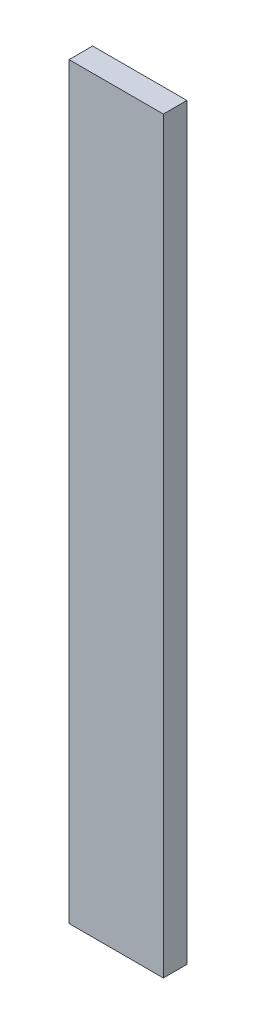
ISO-10303-21;
HEADER;
FILE_DESCRIPTION(('STEP AP214'),'2;1');
FILE_NAME('part.step','',(''),(''),'','','');
FILE_SCHEMA(('AUTOMOTIVE_DESIGN { 1 0 10303 214 1 1 1 1 }'));
ENDSEC;
DATA;
#1=APPLICATION_CONTEXT('core data for automotive mechanical design processes');
#2=APPLICATION_PROTOCOL_DEFINITION('international standard','automotive_design',2000,#1);
#3=PRODUCT_CONTEXT('',#1,'mechanical');
#4=PRODUCT('Part','Part','',(#3));
#5=PRODUCT_RELATED_PRODUCT_CATEGORY('part','',(#4));
#6=PRODUCT_DEFINITION_FORMATION('','',#4);
#7=PRODUCT_DEFINITION_CONTEXT('part definition',#1,'design');
#8=PRODUCT_DEFINITION('design','',#6,#7);
#9=PRODUCT_DEFINITION_SHAPE('','',#8);
#10=(LENGTH_UNIT() NAMED_UNIT(*) SI_UNIT(.MILLI.,.METRE.));
#11=(NAMED_UNIT(*) PLANE_ANGLE_UNIT() SI_UNIT($,.RADIAN.));
#12=(NAMED_UNIT(*) SI_UNIT($,.STERADIAN.) SOLID_ANGLE_UNIT());
#13=UNCERTAINTY_MEASURE_WITH_UNIT(LENGTH_MEASURE(1.E-05),#10,'distance_accuracy_value','');
#14=(GEOMETRIC_REPRESENTATION_CONTEXT(3) GLOBAL_UNCERTAINTY_ASSIGNED_CONTEXT((#13)) GLOBAL_UNIT_ASSIGNED_CONTEXT((#10,
#11,#12)) REPRESENTATION_CONTEXT('',''));
#15=CARTESIAN_POINT('',(0.,0.,0.));
#16=DIRECTION('',(0.,0.,1.));
#17=DIRECTION('',(1.,0.,0.));
#18=AXIS2_PLACEMENT_3D('',#15,#16,#17);
#19=CARTESIAN_POINT('',(0.,0.,0.2));
#20=DIRECTION('',(1.,0.,0.));
#21=DIRECTION('',(0.,0.,-1.));
#22=AXIS2_PLACEMENT_3D('',#19,#20,#21);
#23=PLANE('',#22);
#24=DIRECTION('',(0.,-1.,0.));
#25=VECTOR('',#24,1.);
#26=CARTESIAN_POINT('',(0.,0.,0.));
#27=LINE('',#26,#25);
#28=CARTESIAN_POINT('',(0.,6.35,0.));
#29=VERTEX_POINT('',#28);
#30=CARTESIAN_POINT('',(0.,0.,0.));
#31=VERTEX_POINT('',#30);
#32=EDGE_CURVE('E96',#29,#31,#27,.T.);
#33=ORIENTED_EDGE('',*,*,#32,.T.);
#34=DIRECTION('',(0.,0.,-1.));
#35=VECTOR('',#34,1.);
#36=CARTESIAN_POINT('',(0.,0.,0.2));
#37=LINE('',#36,#35);
#38=CARTESIAN_POINT('',(0.,0.,0.2));
#39=VERTEX_POINT('',#38);
#40=EDGE_CURVE('E11',#39,#31,#37,.T.);
#41=ORIENTED_EDGE('',*,*,#40,.F.);
#42=DIRECTION('',(0.,-1.,0.));
#43=VECTOR('',#42,1.);
#44=CARTESIAN_POINT('',(0.,0.,0.2));
#45=LINE('',#44,#43);
#46=CARTESIAN_POINT('',(0.,6.35,0.2));
#47=VERTEX_POINT('',#46);
#48=EDGE_CURVE('E84',#47,#39,#45,.T.);
#49=ORIENTED_EDGE('',*,*,#48,.F.);
#50=DIRECTION('',(0.,0.,-1.));
#51=VECTOR('',#50,1.);
#52=CARTESIAN_POINT('',(0.,6.35,0.2));
#53=LINE('',#52,#51);
#54=EDGE_CURVE('E92',#47,#29,#53,.T.);
#55=ORIENTED_EDGE('',*,*,#54,.T.);
#56=EDGE_LOOP('',(#33,#41,#49,#55));
#57=FACE_BOUND('',#56,.T.);
#58=ADVANCED_FACE('F33',(#57),#23,.F.);
#59=CARTESIAN_POINT('',(0.,0.,0.2));
#60=DIRECTION('',(0.,1.,0.));
#61=DIRECTION('',(0.,0.,1.));
#62=AXIS2_PLACEMENT_3D('',#59,#60,#61);
#63=PLANE('',#62);
#64=DIRECTION('',(1.,0.,0.));
#65=VECTOR('',#64,1.);
#66=CARTESIAN_POINT('',(0.,0.,0.));
#67=LINE('',#66,#65);
#68=CARTESIAN_POINT('',(0.8001,0.,0.));
#69=VERTEX_POINT('',#68);
#70=EDGE_CURVE('E88',#31,#69,#67,.T.);
#71=ORIENTED_EDGE('',*,*,#70,.T.);
#72=DIRECTION('',(0.,0.,-1.));
#73=VECTOR('',#72,1.);
#74=CARTESIAN_POINT('',(0.8001,0.,0.2));
#75=LINE('',#74,#73);
#76=CARTESIAN_POINT('',(0.8001,0.,0.2));
#77=VERTEX_POINT('',#76);
#78=EDGE_CURVE('E41',#77,#69,#75,.T.);
#79=ORIENTED_EDGE('',*,*,#78,.F.);
#80=DIRECTION('',(1.,0.,0.));
#81=VECTOR('',#80,1.);
#82=CARTESIAN_POINT('',(0.,0.,0.2));
#83=LINE('',#82,#81);
#84=EDGE_CURVE('E79',#39,#77,#83,.T.);
#85=ORIENTED_EDGE('',*,*,#84,.F.);
#86=ORIENTED_EDGE('',*,*,#40,.T.);
#87=EDGE_LOOP('',(#71,#79,#85,#86));
#88=FACE_BOUND('',#87,.T.);
#89=ADVANCED_FACE('F87',(#88),#63,.F.);
#90=CARTESIAN_POINT('',(0.8001,0.,0.2));
#91=DIRECTION('',(-1.,0.,0.));
#92=DIRECTION('',(0.,0.,1.));
#93=AXIS2_PLACEMENT_3D('',#90,#91,#92);
#94=PLANE('',#93);
#95=DIRECTION('',(0.,1.,0.));
#96=VECTOR('',#95,1.);
#97=CARTESIAN_POINT('',(0.8001,0.,0.));
#98=LINE('',#97,#96);
#99=CARTESIAN_POINT('',(0.8001,6.35,0.));
#100=VERTEX_POINT('',#99);
#101=EDGE_CURVE('E66',#69,#100,#98,.T.);
#102=ORIENTED_EDGE('',*,*,#101,.T.);
#103=DIRECTION('',(0.,0.,-1.));
#104=VECTOR('',#103,1.);
#105=CARTESIAN_POINT('',(0.8001,6.35,0.2));
#106=LINE('',#105,#104);
#107=CARTESIAN_POINT('',(0.8001,6.35,0.2));
#108=VERTEX_POINT('',#107);
#109=EDGE_CURVE('E89',#108,#100,#106,.T.);
#110=ORIENTED_EDGE('',*,*,#109,.F.);
#111=DIRECTION('',(0.,1.,0.));
#112=VECTOR('',#111,1.);
#113=CARTESIAN_POINT('',(0.8001,0.,0.2));
#114=LINE('',#113,#112);
#115=EDGE_CURVE('E82',#77,#108,#114,.T.);
#116=ORIENTED_EDGE('',*,*,#115,.F.);
#117=ORIENTED_EDGE('',*,*,#78,.T.);
#118=EDGE_LOOP('',(#102,#110,#116,#117));
#119=FACE_BOUND('',#118,.T.);
#120=ADVANCED_FACE('F90',(#119),#94,.F.);
#121=CARTESIAN_POINT('',(0.,6.35,0.2));
#122=DIRECTION('',(0.,-1.,0.));
#123=DIRECTION('',(0.,0.,-1.));
#124=AXIS2_PLACEMENT_3D('',#121,#122,#123);
#125=PLANE('',#124);
#126=DIRECTION('',(-1.,0.,0.));
#127=VECTOR('',#126,1.);
#128=CARTESIAN_POINT('',(0.,6.35,0.));
#129=LINE('',#128,#127);
#130=EDGE_CURVE('E72',#100,#29,#129,.T.);
#131=ORIENTED_EDGE('',*,*,#130,.T.);
#132=ORIENTED_EDGE('',*,*,#54,.F.);
#133=DIRECTION('',(-1.,0.,0.));
#134=VECTOR('',#133,1.);
#135=CARTESIAN_POINT('',(0.,6.35,0.2));
#136=LINE('',#135,#134);
#137=EDGE_CURVE('E49',#108,#47,#136,.T.);
#138=ORIENTED_EDGE('',*,*,#137,.F.);
#139=ORIENTED_EDGE('',*,*,#109,.T.);
#140=EDGE_LOOP('',(#131,#132,#138,#139));
#141=FACE_BOUND('',#140,.T.);
#142=ADVANCED_FACE('F103',(#141),#125,.F.);
#143=CARTESIAN_POINT('',(0.,0.,0.2));
#144=DIRECTION('',(0.,0.,-1.));
#145=DIRECTION('',(-1.,0.,0.));
#146=AXIS2_PLACEMENT_3D('',#143,#144,#145);
#147=PLANE('',#146);
#148=ORIENTED_EDGE('',*,*,#48,.T.);
#149=ORIENTED_EDGE('',*,*,#84,.T.);
#150=ORIENTED_EDGE('',*,*,#115,.T.);
#151=ORIENTED_EDGE('',*,*,#137,.T.);
#152=EDGE_LOOP('',(#148,#149,#150,#151));
#153=FACE_BOUND('',#152,.T.);
#154=ADVANCED_FACE('F80',(#153),#147,.F.);
#155=CARTESIAN_POINT('',(0.,0.,0.));
#156=DIRECTION('',(0.,0.,-1.));
#157=DIRECTION('',(-1.,0.,0.));
#158=AXIS2_PLACEMENT_3D('',#155,#156,#157);
#159=PLANE('',#158);
#160=ORIENTED_EDGE('',*,*,#32,.F.);
#161=ORIENTED_EDGE('',*,*,#130,.F.);
#162=ORIENTED_EDGE('',*,*,#101,.F.);
#163=ORIENTED_EDGE('',*,*,#70,.F.);
#164=EDGE_LOOP('',(#160,#161,#162,#163));
#165=FACE_BOUND('',#164,.T.);
#166=ADVANCED_FACE('F106',(#165),#159,.T.);
#167=CLOSED_SHELL('',(#58,#89,#120,#142,#154,#166));
#168=MANIFOLD_SOLID_BREP('B2',#167);
#169=ADVANCED_BREP_SHAPE_REPRESENTATION('',(#18,#168),#14);
#170=SHAPE_DEFINITION_REPRESENTATION(#9,#169);
ENDSEC;
END-ISO-10303-21;
